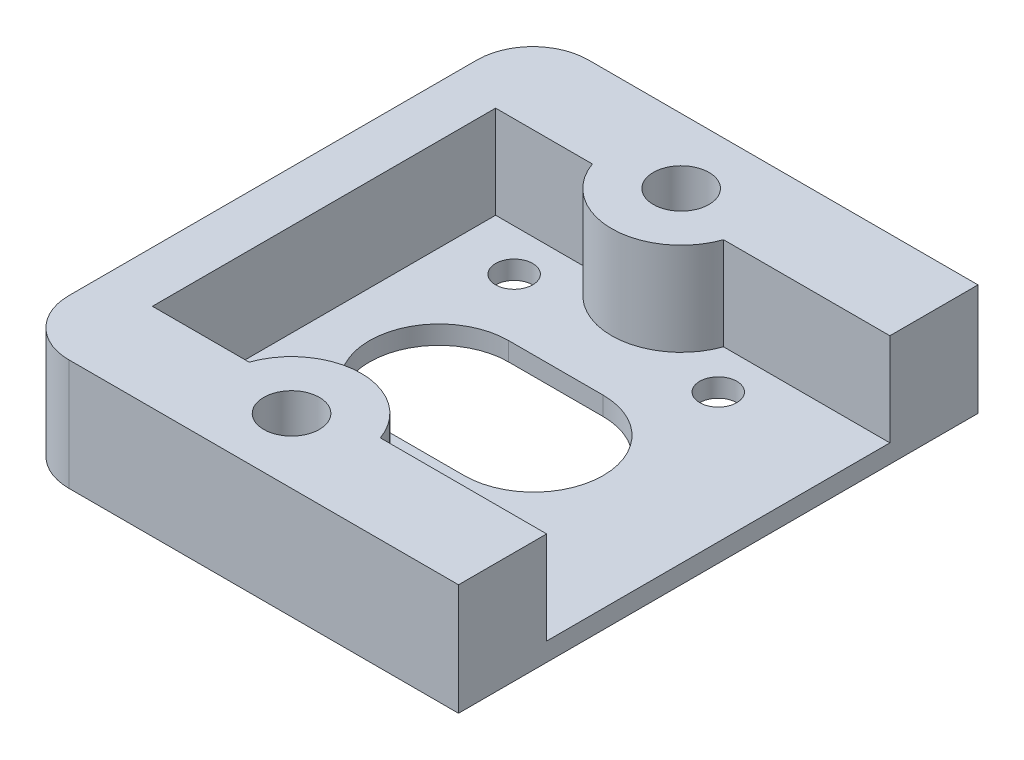
ISO-10303-21;
HEADER;
FILE_DESCRIPTION(('STEP AP214'),'2;1');
FILE_NAME('part.step','',(''),(''),'','','');
FILE_SCHEMA(('AUTOMOTIVE_DESIGN { 1 0 10303 214 1 1 1 1 }'));
ENDSEC;
DATA;
#1=APPLICATION_CONTEXT('core data for automotive mechanical design processes');
#2=APPLICATION_PROTOCOL_DEFINITION('international standard','automotive_design',2000,#1);
#3=PRODUCT_CONTEXT('',#1,'mechanical');
#4=PRODUCT('Part','Part','',(#3));
#5=PRODUCT_RELATED_PRODUCT_CATEGORY('part','',(#4));
#6=PRODUCT_DEFINITION_FORMATION('','',#4);
#7=PRODUCT_DEFINITION_CONTEXT('part definition',#1,'design');
#8=PRODUCT_DEFINITION('design','',#6,#7);
#9=PRODUCT_DEFINITION_SHAPE('','',#8);
#10=(LENGTH_UNIT() NAMED_UNIT(*) SI_UNIT(.MILLI.,.METRE.));
#11=(NAMED_UNIT(*) PLANE_ANGLE_UNIT() SI_UNIT($,.RADIAN.));
#12=(NAMED_UNIT(*) SI_UNIT($,.STERADIAN.) SOLID_ANGLE_UNIT());
#13=UNCERTAINTY_MEASURE_WITH_UNIT(LENGTH_MEASURE(1.E-05),#10,'distance_accuracy_value','');
#14=(GEOMETRIC_REPRESENTATION_CONTEXT(3) GLOBAL_UNCERTAINTY_ASSIGNED_CONTEXT((#13)) GLOBAL_UNIT_ASSIGNED_CONTEXT((#10,
#11,#12)) REPRESENTATION_CONTEXT('',''));
#15=CARTESIAN_POINT('',(0.,0.,0.));
#16=DIRECTION('',(0.,0.,1.));
#17=DIRECTION('',(1.,0.,0.));
#18=AXIS2_PLACEMENT_3D('',#15,#16,#17);
#19=CARTESIAN_POINT('',(2.75,1.,23.25));
#20=DIRECTION('',(0.,0.,1.));
#21=DIRECTION('',(1.,0.,0.));
#22=AXIS2_PLACEMENT_3D('',#19,#20,#21);
#23=PLANE('',#22);
#24=DIRECTION('',(1.,0.,0.));
#25=VECTOR('',#24,1.);
#26=CARTESIAN_POINT('',(2.75,1.,23.25));
#27=LINE('',#26,#25);
#28=CARTESIAN_POINT('',(15.0355339059327,1.,23.25));
#29=VERTEX_POINT('',#28);
#30=CARTESIAN_POINT('',(24.,1.,23.25));
#31=VERTEX_POINT('',#30);
#32=EDGE_CURVE('E189',#29,#31,#27,.T.);
#33=ORIENTED_EDGE('',*,*,#32,.F.);
#34=DIRECTION('',(0.,1.,0.));
#35=VECTOR('',#34,1.);
#36=CARTESIAN_POINT('',(15.0355339059327,0.,23.25));
#37=LINE('',#36,#35);
#38=CARTESIAN_POINT('',(15.0355339059327,6.,23.25));
#39=VERTEX_POINT('',#38);
#40=EDGE_CURVE('E174',#29,#39,#37,.T.);
#41=ORIENTED_EDGE('',*,*,#40,.T.);
#42=DIRECTION('',(1.,0.,0.));
#43=VECTOR('',#42,1.);
#44=CARTESIAN_POINT('',(2.75,6.,23.25));
#45=LINE('',#44,#43);
#46=CARTESIAN_POINT('',(24.,6.,23.25));
#47=VERTEX_POINT('',#46);
#48=EDGE_CURVE('E187',#39,#47,#45,.T.);
#49=ORIENTED_EDGE('',*,*,#48,.T.);
#50=DIRECTION('',(0.,1.,0.));
#51=VECTOR('',#50,1.);
#52=CARTESIAN_POINT('',(24.,1.,23.25));
#53=LINE('',#52,#51);
#54=EDGE_CURVE('E542',#31,#47,#53,.T.);
#55=ORIENTED_EDGE('',*,*,#54,.F.);
#56=EDGE_LOOP('',(#33,#41,#49,#55));
#57=FACE_BOUND('',#56,.T.);
#58=ADVANCED_FACE('F45',(#57),#23,.F.);
#59=CARTESIAN_POINT('',(2.75,1.,4.75));
#60=DIRECTION('',(0.,0.,-1.));
#61=DIRECTION('',(-1.,0.,0.));
#62=AXIS2_PLACEMENT_3D('',#59,#60,#61);
#63=PLANE('',#62);
#64=DIRECTION('',(-1.,0.,0.));
#65=VECTOR('',#64,1.);
#66=CARTESIAN_POINT('',(2.75,1.,4.75));
#67=LINE('',#66,#65);
#68=CARTESIAN_POINT('',(7.96446609406726,1.,4.75));
#69=VERTEX_POINT('',#68);
#70=CARTESIAN_POINT('',(2.75,1.,4.75));
#71=VERTEX_POINT('',#70);
#72=EDGE_CURVE('E361',#69,#71,#67,.T.);
#73=ORIENTED_EDGE('',*,*,#72,.F.);
#74=DIRECTION('',(0.,1.,0.));
#75=VECTOR('',#74,1.);
#76=CARTESIAN_POINT('',(7.96446609406726,0.,4.75));
#77=LINE('',#76,#75);
#78=CARTESIAN_POINT('',(7.96446609406726,6.,4.75));
#79=VERTEX_POINT('',#78);
#80=EDGE_CURVE('E362',#69,#79,#77,.T.);
#81=ORIENTED_EDGE('',*,*,#80,.T.);
#82=DIRECTION('',(-1.,0.,0.));
#83=VECTOR('',#82,1.);
#84=CARTESIAN_POINT('',(2.75,6.,4.75));
#85=LINE('',#84,#83);
#86=CARTESIAN_POINT('',(2.75,6.,4.75));
#87=VERTEX_POINT('',#86);
#88=EDGE_CURVE('E203',#79,#87,#85,.T.);
#89=ORIENTED_EDGE('',*,*,#88,.T.);
#90=DIRECTION('',(0.,1.,0.));
#91=VECTOR('',#90,1.);
#92=CARTESIAN_POINT('',(2.75,1.,4.75));
#93=LINE('',#92,#91);
#94=EDGE_CURVE('E213',#71,#87,#93,.T.);
#95=ORIENTED_EDGE('',*,*,#94,.F.);
#96=EDGE_LOOP('',(#73,#81,#89,#95));
#97=FACE_BOUND('',#96,.T.);
#98=ADVANCED_FACE('F326',(#97),#63,.F.);
#99=CARTESIAN_POINT('',(0.,6.,0.));
#100=DIRECTION('',(1.,0.,0.));
#101=DIRECTION('',(0.,0.,-1.));
#102=AXIS2_PLACEMENT_3D('',#99,#100,#101);
#103=PLANE('',#102);
#104=DIRECTION('',(0.,0.,1.));
#105=VECTOR('',#104,1.);
#106=CARTESIAN_POINT('',(0.,6.,0.));
#107=LINE('',#106,#105);
#108=CARTESIAN_POINT('',(0.,6.,3.));
#109=VERTEX_POINT('',#108);
#110=CARTESIAN_POINT('',(0.,6.,25.));
#111=VERTEX_POINT('',#110);
#112=EDGE_CURVE('E223',#109,#111,#107,.T.);
#113=ORIENTED_EDGE('',*,*,#112,.F.);
#114=DIRECTION('',(0.,-1.,0.));
#115=VECTOR('',#114,1.);
#116=CARTESIAN_POINT('',(0.,6.,3.));
#117=LINE('',#116,#115);
#118=CARTESIAN_POINT('',(0.,0.,3.));
#119=VERTEX_POINT('',#118);
#120=EDGE_CURVE('E273',#109,#119,#117,.T.);
#121=ORIENTED_EDGE('',*,*,#120,.T.);
#122=DIRECTION('',(0.,0.,1.));
#123=VECTOR('',#122,1.);
#124=CARTESIAN_POINT('',(0.,0.,0.));
#125=LINE('',#124,#123);
#126=CARTESIAN_POINT('',(0.,0.,25.));
#127=VERTEX_POINT('',#126);
#128=EDGE_CURVE('E217',#119,#127,#125,.T.);
#129=ORIENTED_EDGE('',*,*,#128,.T.);
#130=DIRECTION('',(0.,-1.,0.));
#131=VECTOR('',#130,1.);
#132=CARTESIAN_POINT('',(0.,6.,25.));
#133=LINE('',#132,#131);
#134=EDGE_CURVE('E270',#127,#111,#133,.F.);
#135=ORIENTED_EDGE('',*,*,#134,.T.);
#136=EDGE_LOOP('',(#113,#121,#129,#135));
#137=FACE_BOUND('',#136,.T.);
#138=ADVANCED_FACE('F333',(#137),#103,.F.);
#139=CARTESIAN_POINT('',(0.,6.,28.));
#140=DIRECTION('',(0.,0.,-1.));
#141=DIRECTION('',(-1.,0.,0.));
#142=AXIS2_PLACEMENT_3D('',#139,#140,#141);
#143=PLANE('',#142);
#144=DIRECTION('',(0.,-1.,0.));
#145=VECTOR('',#144,1.);
#146=CARTESIAN_POINT('',(24.,6.,28.));
#147=LINE('',#146,#145);
#148=CARTESIAN_POINT('',(24.,6.,28.));
#149=VERTEX_POINT('',#148);
#150=CARTESIAN_POINT('',(24.,0.,28.));
#151=VERTEX_POINT('',#150);
#152=EDGE_CURVE('E250',#149,#151,#147,.T.);
#153=ORIENTED_EDGE('',*,*,#152,.F.);
#154=DIRECTION('',(1.,0.,0.));
#155=VECTOR('',#154,1.);
#156=CARTESIAN_POINT('',(0.,6.,28.));
#157=LINE('',#156,#155);
#158=CARTESIAN_POINT('',(3.00000000000001,6.,28.));
#159=VERTEX_POINT('',#158);
#160=EDGE_CURVE('E226',#159,#149,#157,.T.);
#161=ORIENTED_EDGE('',*,*,#160,.F.);
#162=DIRECTION('',(0.,-1.,0.));
#163=VECTOR('',#162,1.);
#164=CARTESIAN_POINT('',(3.00000000000001,6.,28.));
#165=LINE('',#164,#163);
#166=CARTESIAN_POINT('',(3.00000000000001,0.,28.));
#167=VERTEX_POINT('',#166);
#168=EDGE_CURVE('E292',#159,#167,#165,.T.);
#169=ORIENTED_EDGE('',*,*,#168,.T.);
#170=DIRECTION('',(1.,0.,0.));
#171=VECTOR('',#170,1.);
#172=CARTESIAN_POINT('',(0.,0.,28.));
#173=LINE('',#172,#171);
#174=EDGE_CURVE('E239',#167,#151,#173,.T.);
#175=ORIENTED_EDGE('',*,*,#174,.T.);
#176=EDGE_LOOP('',(#153,#161,#169,#175));
#177=FACE_BOUND('',#176,.T.);
#178=ADVANCED_FACE('F398',(#177),#143,.F.);
#179=CARTESIAN_POINT('',(24.,6.,0.));
#180=DIRECTION('',(-1.,0.,0.));
#181=DIRECTION('',(0.,0.,1.));
#182=AXIS2_PLACEMENT_3D('',#179,#180,#181);
#183=PLANE('',#182);
#184=DIRECTION('',(0.,0.,-1.));
#185=VECTOR('',#184,1.);
#186=CARTESIAN_POINT('',(24.,6.,0.));
#187=LINE('',#186,#185);
#188=CARTESIAN_POINT('',(24.,6.,4.75));
#189=VERTEX_POINT('',#188);
#190=CARTESIAN_POINT('',(24.,6.,0.));
#191=VERTEX_POINT('',#190);
#192=EDGE_CURVE('E230',#189,#191,#187,.T.);
#193=ORIENTED_EDGE('',*,*,#192,.F.);
#194=DIRECTION('',(0.,1.,0.));
#195=VECTOR('',#194,1.);
#196=CARTESIAN_POINT('',(24.,1.,4.75));
#197=LINE('',#196,#195);
#198=CARTESIAN_POINT('',(24.,1.,4.75));
#199=VERTEX_POINT('',#198);
#200=EDGE_CURVE('E540',#199,#189,#197,.T.);
#201=ORIENTED_EDGE('',*,*,#200,.F.);
#202=DIRECTION('',(0.,0.,-1.));
#203=VECTOR('',#202,1.);
#204=CARTESIAN_POINT('',(24.,1.,4.75));
#205=LINE('',#204,#203);
#206=EDGE_CURVE('E545',#31,#199,#205,.T.);
#207=ORIENTED_EDGE('',*,*,#206,.F.);
#208=ORIENTED_EDGE('',*,*,#54,.T.);
#209=EDGE_CURVE('E196',#149,#47,#187,.T.);
#210=ORIENTED_EDGE('',*,*,#209,.F.);
#211=ORIENTED_EDGE('',*,*,#152,.T.);
#212=DIRECTION('',(0.,0.,-1.));
#213=VECTOR('',#212,1.);
#214=CARTESIAN_POINT('',(24.,0.,0.));
#215=LINE('',#214,#213);
#216=CARTESIAN_POINT('',(24.,0.,0.));
#217=VERTEX_POINT('',#216);
#218=EDGE_CURVE('E242',#151,#217,#215,.T.);
#219=ORIENTED_EDGE('',*,*,#218,.T.);
#220=DIRECTION('',(0.,-1.,0.));
#221=VECTOR('',#220,1.);
#222=CARTESIAN_POINT('',(24.,6.,0.));
#223=LINE('',#222,#221);
#224=EDGE_CURVE('E235',#191,#217,#223,.T.);
#225=ORIENTED_EDGE('',*,*,#224,.F.);
#226=EDGE_LOOP('',(#193,#201,#207,#208,#210,#211,#219,#225));
#227=FACE_BOUND('',#226,.T.);
#228=ADVANCED_FACE('F379',(#227),#183,.F.);
#229=CARTESIAN_POINT('',(0.,6.,0.));
#230=DIRECTION('',(0.,0.,1.));
#231=DIRECTION('',(1.,0.,0.));
#232=AXIS2_PLACEMENT_3D('',#229,#230,#231);
#233=PLANE('',#232);
#234=DIRECTION('',(0.,-1.,0.));
#235=VECTOR('',#234,1.);
#236=CARTESIAN_POINT('',(3.,6.,0.));
#237=LINE('',#236,#235);
#238=CARTESIAN_POINT('',(3.,0.,0.));
#239=VERTEX_POINT('',#238);
#240=CARTESIAN_POINT('',(3.,6.,0.));
#241=VERTEX_POINT('',#240);
#242=EDGE_CURVE('E284',#239,#241,#237,.F.);
#243=ORIENTED_EDGE('',*,*,#242,.T.);
#244=DIRECTION('',(-1.,0.,0.));
#245=VECTOR('',#244,1.);
#246=CARTESIAN_POINT('',(0.,6.,0.));
#247=LINE('',#246,#245);
#248=EDGE_CURVE('E70',#191,#241,#247,.T.);
#249=ORIENTED_EDGE('',*,*,#248,.F.);
#250=ORIENTED_EDGE('',*,*,#224,.T.);
#251=DIRECTION('',(-1.,0.,0.));
#252=VECTOR('',#251,1.);
#253=CARTESIAN_POINT('',(0.,0.,0.));
#254=LINE('',#253,#252);
#255=EDGE_CURVE('E227',#217,#239,#254,.T.);
#256=ORIENTED_EDGE('',*,*,#255,.T.);
#257=EDGE_LOOP('',(#243,#249,#250,#256));
#258=FACE_BOUND('',#257,.T.);
#259=ADVANCED_FACE('F383',(#258),#233,.F.);
#260=CARTESIAN_POINT('',(0.,6.,0.));
#261=DIRECTION('',(0.,1.,0.));
#262=DIRECTION('',(0.,0.,1.));
#263=AXIS2_PLACEMENT_3D('',#260,#261,#262);
#264=PLANE('',#263);
#265=CARTESIAN_POINT('',(11.5,6.,3.5));
#266=DIRECTION('',(0.,1.,0.));
#267=DIRECTION('',(0.,0.,1.));
#268=AXIS2_PLACEMENT_3D('',#265,#266,#267);
#269=CIRCLE('',#268,1.5);
#270=CARTESIAN_POINT('',(11.5,6.,5.));
#271=VERTEX_POINT('',#270);
#272=EDGE_CURVE('E191',#271,#271,#269,.T.);
#273=ORIENTED_EDGE('',*,*,#272,.F.);
#274=EDGE_LOOP('',(#273));
#275=FACE_BOUND('',#274,.T.);
#276=CARTESIAN_POINT('',(11.5,6.,24.5));
#277=DIRECTION('',(0.,1.,0.));
#278=DIRECTION('',(0.,0.,1.));
#279=AXIS2_PLACEMENT_3D('',#276,#277,#278);
#280=CIRCLE('',#279,1.5);
#281=CARTESIAN_POINT('',(11.5,6.,26.));
#282=VERTEX_POINT('',#281);
#283=EDGE_CURVE('E182',#282,#282,#280,.T.);
#284=ORIENTED_EDGE('',*,*,#283,.F.);
#285=EDGE_LOOP('',(#284));
#286=FACE_BOUND('',#285,.T.);
#287=ORIENTED_EDGE('',*,*,#160,.T.);
#288=ORIENTED_EDGE('',*,*,#209,.T.);
#289=ORIENTED_EDGE('',*,*,#48,.F.);
#290=CARTESIAN_POINT('',(11.5,6.,24.5));
#291=DIRECTION('',(0.,1.,0.));
#292=DIRECTION('',(0.,0.,-1.));
#293=AXIS2_PLACEMENT_3D('',#290,#291,#292);
#294=CIRCLE('',#293,3.75);
#295=CARTESIAN_POINT('',(7.96446609406726,6.,23.25));
#296=VERTEX_POINT('',#295);
#297=EDGE_CURVE('E171',#39,#296,#294,.T.);
#298=ORIENTED_EDGE('',*,*,#297,.T.);
#299=CARTESIAN_POINT('',(2.75,6.,23.25));
#300=VERTEX_POINT('',#299);
#301=EDGE_CURVE('E198',#300,#296,#45,.T.);
#302=ORIENTED_EDGE('',*,*,#301,.F.);
#303=DIRECTION('',(0.,0.,1.));
#304=VECTOR('',#303,1.);
#305=CARTESIAN_POINT('',(2.75,6.,4.75));
#306=LINE('',#305,#304);
#307=EDGE_CURVE('E199',#87,#300,#306,.T.);
#308=ORIENTED_EDGE('',*,*,#307,.F.);
#309=ORIENTED_EDGE('',*,*,#88,.F.);
#310=CARTESIAN_POINT('',(11.5,6.,3.5));
#311=DIRECTION('',(0.,1.,0.));
#312=DIRECTION('',(0.,0.,1.));
#313=AXIS2_PLACEMENT_3D('',#310,#311,#312);
#314=CIRCLE('',#313,3.75);
#315=CARTESIAN_POINT('',(15.0355339059327,6.,4.75));
#316=VERTEX_POINT('',#315);
#317=EDGE_CURVE('E557',#79,#316,#314,.T.);
#318=ORIENTED_EDGE('',*,*,#317,.T.);
#319=EDGE_CURVE('E208',#189,#316,#85,.T.);
#320=ORIENTED_EDGE('',*,*,#319,.F.);
#321=ORIENTED_EDGE('',*,*,#192,.T.);
#322=ORIENTED_EDGE('',*,*,#248,.T.);
#323=CARTESIAN_POINT('',(3.,6.,3.));
#324=DIRECTION('',(0.,1.,0.));
#325=DIRECTION('',(0.,0.,1.));
#326=AXIS2_PLACEMENT_3D('',#323,#324,#325);
#327=CIRCLE('',#326,3.);
#328=EDGE_CURVE('E289',#241,#109,#327,.T.);
#329=ORIENTED_EDGE('',*,*,#328,.T.);
#330=ORIENTED_EDGE('',*,*,#112,.T.);
#331=CARTESIAN_POINT('',(3.00000000000001,6.,25.));
#332=DIRECTION('',(0.,1.,0.));
#333=DIRECTION('',(0.,0.,1.));
#334=AXIS2_PLACEMENT_3D('',#331,#332,#333);
#335=CIRCLE('',#334,3.);
#336=EDGE_CURVE('E63',#111,#159,#335,.T.);
#337=ORIENTED_EDGE('',*,*,#336,.T.);
#338=EDGE_LOOP('',(#287,#288,#289,#298,#302,#308,#309,#318,#320,#321,#322,#329,#330,#337));
#339=FACE_BOUND('',#338,.T.);
#340=ADVANCED_FACE('F194',(#275,#286,#339),#264,.T.);
#341=CARTESIAN_POINT('',(0.,0.,0.));
#342=DIRECTION('',(0.,1.,0.));
#343=DIRECTION('',(0.,0.,1.));
#344=AXIS2_PLACEMENT_3D('',#341,#342,#343);
#345=PLANE('',#344);
#346=CARTESIAN_POINT('',(11.5,0.,3.5));
#347=DIRECTION('',(0.,1.,0.));
#348=DIRECTION('',(0.,0.,1.));
#349=AXIS2_PLACEMENT_3D('',#346,#347,#348);
#350=CIRCLE('',#349,1.5);
#351=CARTESIAN_POINT('',(11.5,0.,5.));
#352=VERTEX_POINT('',#351);
#353=EDGE_CURVE('E49',#352,#352,#350,.T.);
#354=ORIENTED_EDGE('',*,*,#353,.T.);
#355=EDGE_LOOP('',(#354));
#356=FACE_BOUND('',#355,.T.);
#357=CARTESIAN_POINT('',(11.5,0.,24.5));
#358=DIRECTION('',(0.,1.,0.));
#359=DIRECTION('',(0.,0.,1.));
#360=AXIS2_PLACEMENT_3D('',#357,#358,#359);
#361=CIRCLE('',#360,1.5);
#362=CARTESIAN_POINT('',(11.5,0.,26.));
#363=VERTEX_POINT('',#362);
#364=EDGE_CURVE('E297',#363,#363,#361,.T.);
#365=ORIENTED_EDGE('',*,*,#364,.T.);
#366=EDGE_LOOP('',(#365));
#367=FACE_BOUND('',#366,.T.);
#368=CARTESIAN_POINT('',(17.,0.,7.));
#369=DIRECTION('',(0.,1.,0.));
#370=DIRECTION('',(0.,0.,1.));
#371=AXIS2_PLACEMENT_3D('',#368,#369,#370);
#372=CIRCLE('',#371,0.999999999999998);
#373=CARTESIAN_POINT('',(17.,0.,8.));
#374=VERTEX_POINT('',#373);
#375=EDGE_CURVE('E204',#374,#374,#372,.T.);
#376=ORIENTED_EDGE('',*,*,#375,.T.);
#377=EDGE_LOOP('',(#376));
#378=FACE_BOUND('',#377,.T.);
#379=CARTESIAN_POINT('',(17.,0.,21.));
#380=DIRECTION('',(0.,1.,0.));
#381=DIRECTION('',(0.,0.,1.));
#382=AXIS2_PLACEMENT_3D('',#379,#380,#381);
#383=CIRCLE('',#382,0.999999999999998);
#384=CARTESIAN_POINT('',(17.,0.,22.));
#385=VERTEX_POINT('',#384);
#386=EDGE_CURVE('E497',#385,#385,#383,.T.);
#387=ORIENTED_EDGE('',*,*,#386,.T.);
#388=EDGE_LOOP('',(#387));
#389=FACE_BOUND('',#388,.T.);
#390=CARTESIAN_POINT('',(6.,0.,21.));
#391=DIRECTION('',(0.,1.,0.));
#392=DIRECTION('',(0.,0.,1.));
#393=AXIS2_PLACEMENT_3D('',#390,#391,#392);
#394=CIRCLE('',#393,1.);
#395=CARTESIAN_POINT('',(6.,0.,22.));
#396=VERTEX_POINT('',#395);
#397=EDGE_CURVE('E493',#396,#396,#394,.T.);
#398=ORIENTED_EDGE('',*,*,#397,.T.);
#399=EDGE_LOOP('',(#398));
#400=FACE_BOUND('',#399,.T.);
#401=CARTESIAN_POINT('',(6.,0.,7.));
#402=DIRECTION('',(0.,1.,0.));
#403=DIRECTION('',(0.,0.,1.));
#404=AXIS2_PLACEMENT_3D('',#401,#402,#403);
#405=CIRCLE('',#404,1.);
#406=CARTESIAN_POINT('',(6.,0.,8.));
#407=VERTEX_POINT('',#406);
#408=EDGE_CURVE('E452',#407,#407,#405,.T.);
#409=ORIENTED_EDGE('',*,*,#408,.T.);
#410=EDGE_LOOP('',(#409));
#411=FACE_BOUND('',#410,.T.);
#412=DIRECTION('',(-1.,0.,0.));
#413=VECTOR('',#412,1.);
#414=CARTESIAN_POINT('',(0.,0.,10.25));
#415=LINE('',#414,#413);
#416=CARTESIAN_POINT('',(14.05,0.,10.25));
#417=VERTEX_POINT('',#416);
#418=CARTESIAN_POINT('',(8.95,0.,10.25));
#419=VERTEX_POINT('',#418);
#420=EDGE_CURVE('E262',#417,#419,#415,.T.);
#421=ORIENTED_EDGE('',*,*,#420,.T.);
#422=CARTESIAN_POINT('',(8.95,0.,14.));
#423=DIRECTION('',(0.,1.,0.));
#424=DIRECTION('',(0.,0.,1.));
#425=AXIS2_PLACEMENT_3D('',#422,#423,#424);
#426=CIRCLE('',#425,3.75);
#427=CARTESIAN_POINT('',(8.95,0.,17.75));
#428=VERTEX_POINT('',#427);
#429=EDGE_CURVE('E266',#419,#428,#426,.T.);
#430=ORIENTED_EDGE('',*,*,#429,.T.);
#431=DIRECTION('',(1.,0.,0.));
#432=VECTOR('',#431,1.);
#433=CARTESIAN_POINT('',(0.,0.,17.75));
#434=LINE('',#433,#432);
#435=CARTESIAN_POINT('',(14.05,0.,17.75));
#436=VERTEX_POINT('',#435);
#437=EDGE_CURVE('E254',#428,#436,#434,.T.);
#438=ORIENTED_EDGE('',*,*,#437,.T.);
#439=CARTESIAN_POINT('',(14.05,0.,14.));
#440=DIRECTION('',(0.,1.,0.));
#441=DIRECTION('',(0.,0.,1.));
#442=AXIS2_PLACEMENT_3D('',#439,#440,#441);
#443=CIRCLE('',#442,3.75);
#444=EDGE_CURVE('E258',#436,#417,#443,.T.);
#445=ORIENTED_EDGE('',*,*,#444,.T.);
#446=EDGE_LOOP('',(#421,#430,#438,#445));
#447=FACE_BOUND('',#446,.T.);
#448=ORIENTED_EDGE('',*,*,#218,.F.);
#449=ORIENTED_EDGE('',*,*,#174,.F.);
#450=CARTESIAN_POINT('',(3.00000000000001,0.,25.));
#451=DIRECTION('',(0.,1.,0.));
#452=DIRECTION('',(0.,0.,1.));
#453=AXIS2_PLACEMENT_3D('',#450,#451,#452);
#454=CIRCLE('',#453,3.);
#455=EDGE_CURVE('E277',#167,#127,#454,.F.);
#456=ORIENTED_EDGE('',*,*,#455,.T.);
#457=ORIENTED_EDGE('',*,*,#128,.F.);
#458=CARTESIAN_POINT('',(3.,0.,3.));
#459=DIRECTION('',(0.,1.,0.));
#460=DIRECTION('',(0.,0.,1.));
#461=AXIS2_PLACEMENT_3D('',#458,#459,#460);
#462=CIRCLE('',#461,3.);
#463=EDGE_CURVE('E280',#119,#239,#462,.F.);
#464=ORIENTED_EDGE('',*,*,#463,.T.);
#465=ORIENTED_EDGE('',*,*,#255,.F.);
#466=EDGE_LOOP('',(#448,#449,#456,#457,#464,#465));
#467=FACE_BOUND('',#466,.T.);
#468=ADVANCED_FACE('F306',(#356,#367,#378,#389,#400,#411,#447,#467),#345,.F.);
#469=CARTESIAN_POINT('',(2.75,1.,4.75));
#470=DIRECTION('',(-1.,0.,0.));
#471=DIRECTION('',(0.,0.,1.));
#472=AXIS2_PLACEMENT_3D('',#469,#470,#471);
#473=PLANE('',#472);
#474=ORIENTED_EDGE('',*,*,#307,.T.);
#475=DIRECTION('',(0.,1.,0.));
#476=VECTOR('',#475,1.);
#477=CARTESIAN_POINT('',(2.75,1.,23.25));
#478=LINE('',#477,#476);
#479=CARTESIAN_POINT('',(2.75,1.,23.25));
#480=VERTEX_POINT('',#479);
#481=EDGE_CURVE('E218',#480,#300,#478,.T.);
#482=ORIENTED_EDGE('',*,*,#481,.F.);
#483=DIRECTION('',(0.,0.,1.));
#484=VECTOR('',#483,1.);
#485=CARTESIAN_POINT('',(2.75,1.,4.75));
#486=LINE('',#485,#484);
#487=EDGE_CURVE('E212',#71,#480,#486,.T.);
#488=ORIENTED_EDGE('',*,*,#487,.F.);
#489=ORIENTED_EDGE('',*,*,#94,.T.);
#490=EDGE_LOOP('',(#474,#482,#488,#489));
#491=FACE_BOUND('',#490,.T.);
#492=ADVANCED_FACE('F348',(#491),#473,.F.);
#493=ORIENTED_EDGE('',*,*,#319,.T.);
#494=DIRECTION('',(0.,1.,0.));
#495=VECTOR('',#494,1.);
#496=CARTESIAN_POINT('',(15.0355339059327,0.,4.75));
#497=LINE('',#496,#495);
#498=CARTESIAN_POINT('',(15.0355339059327,1.,4.75));
#499=VERTEX_POINT('',#498);
#500=EDGE_CURVE('E553',#316,#499,#497,.F.);
#501=ORIENTED_EDGE('',*,*,#500,.T.);
#502=EDGE_CURVE('E222',#199,#499,#67,.T.);
#503=ORIENTED_EDGE('',*,*,#502,.F.);
#504=ORIENTED_EDGE('',*,*,#200,.T.);
#505=EDGE_LOOP('',(#493,#501,#503,#504));
#506=FACE_BOUND('',#505,.T.);
#507=ADVANCED_FACE('F336',(#506),#63,.F.);
#508=ORIENTED_EDGE('',*,*,#301,.T.);
#509=DIRECTION('',(0.,1.,0.));
#510=VECTOR('',#509,1.);
#511=CARTESIAN_POINT('',(7.96446609406726,0.,23.25));
#512=LINE('',#511,#510);
#513=CARTESIAN_POINT('',(7.96446609406726,1.,23.25));
#514=VERTEX_POINT('',#513);
#515=EDGE_CURVE('E177',#296,#514,#512,.F.);
#516=ORIENTED_EDGE('',*,*,#515,.T.);
#517=EDGE_CURVE('E368',#480,#514,#27,.T.);
#518=ORIENTED_EDGE('',*,*,#517,.F.);
#519=ORIENTED_EDGE('',*,*,#481,.T.);
#520=EDGE_LOOP('',(#508,#516,#518,#519));
#521=FACE_BOUND('',#520,.T.);
#522=ADVANCED_FACE('F328',(#521),#23,.F.);
#523=CARTESIAN_POINT('',(0.,1.,0.));
#524=DIRECTION('',(0.,1.,0.));
#525=DIRECTION('',(0.,0.,1.));
#526=AXIS2_PLACEMENT_3D('',#523,#524,#525);
#527=PLANE('',#526);
#528=CARTESIAN_POINT('',(11.5,1.,24.5));
#529=DIRECTION('',(0.,1.,0.));
#530=DIRECTION('',(0.,0.,1.));
#531=AXIS2_PLACEMENT_3D('',#528,#529,#530);
#532=CIRCLE('',#531,3.75);
#533=EDGE_CURVE('E11',#29,#514,#532,.T.);
#534=ORIENTED_EDGE('',*,*,#533,.F.);
#535=ORIENTED_EDGE('',*,*,#32,.T.);
#536=ORIENTED_EDGE('',*,*,#206,.T.);
#537=ORIENTED_EDGE('',*,*,#502,.T.);
#538=CARTESIAN_POINT('',(11.5,1.,3.5));
#539=DIRECTION('',(0.,1.,0.));
#540=DIRECTION('',(0.,0.,1.));
#541=AXIS2_PLACEMENT_3D('',#538,#539,#540);
#542=CIRCLE('',#541,3.75);
#543=EDGE_CURVE('E55',#69,#499,#542,.T.);
#544=ORIENTED_EDGE('',*,*,#543,.F.);
#545=ORIENTED_EDGE('',*,*,#72,.T.);
#546=ORIENTED_EDGE('',*,*,#487,.T.);
#547=ORIENTED_EDGE('',*,*,#517,.T.);
#548=EDGE_LOOP('',(#534,#535,#536,#537,#544,#545,#546,#547));
#549=FACE_BOUND('',#548,.T.);
#550=CARTESIAN_POINT('',(8.95,1.,14.));
#551=DIRECTION('',(0.,1.,0.));
#552=DIRECTION('',(0.,0.,1.));
#553=AXIS2_PLACEMENT_3D('',#550,#551,#552);
#554=CIRCLE('',#553,3.75);
#555=CARTESIAN_POINT('',(8.95,1.,10.25));
#556=VERTEX_POINT('',#555);
#557=CARTESIAN_POINT('',(8.95,1.,17.75));
#558=VERTEX_POINT('',#557);
#559=EDGE_CURVE('E449',#556,#558,#554,.T.);
#560=ORIENTED_EDGE('',*,*,#559,.F.);
#561=DIRECTION('',(-1.,0.,0.));
#562=VECTOR('',#561,1.);
#563=CARTESIAN_POINT('',(8.95,1.,10.25));
#564=LINE('',#563,#562);
#565=CARTESIAN_POINT('',(14.05,1.,10.25));
#566=VERTEX_POINT('',#565);
#567=EDGE_CURVE('E457',#566,#556,#564,.T.);
#568=ORIENTED_EDGE('',*,*,#567,.F.);
#569=CARTESIAN_POINT('',(14.05,1.,14.));
#570=DIRECTION('',(0.,1.,0.));
#571=DIRECTION('',(0.,0.,1.));
#572=AXIS2_PLACEMENT_3D('',#569,#570,#571);
#573=CIRCLE('',#572,3.75);
#574=CARTESIAN_POINT('',(14.05,1.,17.75));
#575=VERTEX_POINT('',#574);
#576=EDGE_CURVE('E463',#575,#566,#573,.T.);
#577=ORIENTED_EDGE('',*,*,#576,.F.);
#578=DIRECTION('',(1.,0.,0.));
#579=VECTOR('',#578,1.);
#580=CARTESIAN_POINT('',(8.95,1.,17.75));
#581=LINE('',#580,#579);
#582=EDGE_CURVE('E467',#558,#575,#581,.T.);
#583=ORIENTED_EDGE('',*,*,#582,.F.);
#584=EDGE_LOOP('',(#560,#568,#577,#583));
#585=FACE_BOUND('',#584,.T.);
#586=CARTESIAN_POINT('',(17.,1.,7.));
#587=DIRECTION('',(0.,1.,0.));
#588=DIRECTION('',(0.,0.,-1.));
#589=AXIS2_PLACEMENT_3D('',#586,#587,#588);
#590=CIRCLE('',#589,0.999999999999998);
#591=CARTESIAN_POINT('',(17.,1.,6.));
#592=VERTEX_POINT('',#591);
#593=EDGE_CURVE('E478',#592,#592,#590,.T.);
#594=ORIENTED_EDGE('',*,*,#593,.F.);
#595=EDGE_LOOP('',(#594));
#596=FACE_BOUND('',#595,.T.);
#597=CARTESIAN_POINT('',(17.,1.,21.));
#598=DIRECTION('',(0.,1.,0.));
#599=DIRECTION('',(0.,0.,1.));
#600=AXIS2_PLACEMENT_3D('',#597,#598,#599);
#601=CIRCLE('',#600,0.999999999999998);
#602=CARTESIAN_POINT('',(17.,1.,22.));
#603=VERTEX_POINT('',#602);
#604=EDGE_CURVE('E532',#603,#603,#601,.T.);
#605=ORIENTED_EDGE('',*,*,#604,.F.);
#606=EDGE_LOOP('',(#605));
#607=FACE_BOUND('',#606,.T.);
#608=CARTESIAN_POINT('',(6.,1.,21.));
#609=DIRECTION('',(0.,1.,0.));
#610=DIRECTION('',(0.,0.,-1.));
#611=AXIS2_PLACEMENT_3D('',#608,#609,#610);
#612=CIRCLE('',#611,1.);
#613=CARTESIAN_POINT('',(6.,1.,20.));
#614=VERTEX_POINT('',#613);
#615=EDGE_CURVE('E475',#614,#614,#612,.T.);
#616=ORIENTED_EDGE('',*,*,#615,.F.);
#617=EDGE_LOOP('',(#616));
#618=FACE_BOUND('',#617,.T.);
#619=CARTESIAN_POINT('',(6.,1.,7.));
#620=DIRECTION('',(0.,1.,0.));
#621=DIRECTION('',(0.,0.,1.));
#622=AXIS2_PLACEMENT_3D('',#619,#620,#621);
#623=CIRCLE('',#622,1.);
#624=CARTESIAN_POINT('',(6.,1.,8.));
#625=VERTEX_POINT('',#624);
#626=EDGE_CURVE('E469',#625,#625,#623,.T.);
#627=ORIENTED_EDGE('',*,*,#626,.F.);
#628=EDGE_LOOP('',(#627));
#629=FACE_BOUND('',#628,.T.);
#630=ADVANCED_FACE('F339',(#549,#585,#596,#607,#618,#629),#527,.T.);
#631=CARTESIAN_POINT('',(6.,-4.,7.));
#632=DIRECTION('',(0.,1.,0.));
#633=DIRECTION('',(0.,0.,1.));
#634=AXIS2_PLACEMENT_3D('',#631,#632,#633);
#635=CYLINDRICAL_SURFACE('',#634,1.);
#636=ORIENTED_EDGE('',*,*,#626,.T.);
#637=EDGE_LOOP('',(#636));
#638=FACE_BOUND('',#637,.T.);
#639=ORIENTED_EDGE('',*,*,#408,.F.);
#640=EDGE_LOOP('',(#639));
#641=FACE_BOUND('',#640,.T.);
#642=ADVANCED_FACE('F345',(#638,#641),#635,.F.);
#643=CARTESIAN_POINT('',(6.,-4.,21.));
#644=DIRECTION('',(0.,1.,0.));
#645=DIRECTION('',(0.,0.,1.));
#646=AXIS2_PLACEMENT_3D('',#643,#644,#645);
#647=CYLINDRICAL_SURFACE('',#646,1.);
#648=ORIENTED_EDGE('',*,*,#615,.T.);
#649=EDGE_LOOP('',(#648));
#650=FACE_BOUND('',#649,.T.);
#651=ORIENTED_EDGE('',*,*,#397,.F.);
#652=EDGE_LOOP('',(#651));
#653=FACE_BOUND('',#652,.T.);
#654=ADVANCED_FACE('F516',(#650,#653),#647,.F.);
#655=CARTESIAN_POINT('',(17.,-4.,21.));
#656=DIRECTION('',(0.,1.,0.));
#657=DIRECTION('',(0.,0.,1.));
#658=AXIS2_PLACEMENT_3D('',#655,#656,#657);
#659=CYLINDRICAL_SURFACE('',#658,0.999999999999998);
#660=ORIENTED_EDGE('',*,*,#604,.T.);
#661=EDGE_LOOP('',(#660));
#662=FACE_BOUND('',#661,.T.);
#663=ORIENTED_EDGE('',*,*,#386,.F.);
#664=EDGE_LOOP('',(#663));
#665=FACE_BOUND('',#664,.T.);
#666=ADVANCED_FACE('F440',(#662,#665),#659,.F.);
#667=CARTESIAN_POINT('',(17.,-4.,7.));
#668=DIRECTION('',(0.,1.,0.));
#669=DIRECTION('',(0.,0.,1.));
#670=AXIS2_PLACEMENT_3D('',#667,#668,#669);
#671=CYLINDRICAL_SURFACE('',#670,0.999999999999998);
#672=ORIENTED_EDGE('',*,*,#593,.T.);
#673=EDGE_LOOP('',(#672));
#674=FACE_BOUND('',#673,.T.);
#675=ORIENTED_EDGE('',*,*,#375,.F.);
#676=EDGE_LOOP('',(#675));
#677=FACE_BOUND('',#676,.T.);
#678=ADVANCED_FACE('F433',(#674,#677),#671,.F.);
#679=CARTESIAN_POINT('',(8.95,-4.,14.));
#680=DIRECTION('',(0.,1.,0.));
#681=DIRECTION('',(0.,0.,1.));
#682=AXIS2_PLACEMENT_3D('',#679,#680,#681);
#683=CYLINDRICAL_SURFACE('',#682,3.75);
#684=DIRECTION('',(0.,1.,0.));
#685=VECTOR('',#684,1.);
#686=CARTESIAN_POINT('',(8.95,-4.,10.25));
#687=LINE('',#686,#685);
#688=EDGE_CURVE('E445',#419,#556,#687,.T.);
#689=ORIENTED_EDGE('',*,*,#688,.T.);
#690=ORIENTED_EDGE('',*,*,#559,.T.);
#691=DIRECTION('',(0.,1.,0.));
#692=VECTOR('',#691,1.);
#693=CARTESIAN_POINT('',(8.95,-4.,17.75));
#694=LINE('',#693,#692);
#695=EDGE_CURVE('E462',#428,#558,#694,.T.);
#696=ORIENTED_EDGE('',*,*,#695,.F.);
#697=ORIENTED_EDGE('',*,*,#429,.F.);
#698=EDGE_LOOP('',(#689,#690,#696,#697));
#699=FACE_BOUND('',#698,.T.);
#700=ADVANCED_FACE('F431',(#699),#683,.F.);
#701=CARTESIAN_POINT('',(8.95,-4.,10.25));
#702=DIRECTION('',(0.,0.,-1.));
#703=DIRECTION('',(-1.,0.,0.));
#704=AXIS2_PLACEMENT_3D('',#701,#702,#703);
#705=PLANE('',#704);
#706=DIRECTION('',(0.,1.,0.));
#707=VECTOR('',#706,1.);
#708=CARTESIAN_POINT('',(14.05,-4.,10.25));
#709=LINE('',#708,#707);
#710=EDGE_CURVE('E453',#417,#566,#709,.T.);
#711=ORIENTED_EDGE('',*,*,#710,.T.);
#712=ORIENTED_EDGE('',*,*,#567,.T.);
#713=ORIENTED_EDGE('',*,*,#688,.F.);
#714=ORIENTED_EDGE('',*,*,#420,.F.);
#715=EDGE_LOOP('',(#711,#712,#713,#714));
#716=FACE_BOUND('',#715,.T.);
#717=ADVANCED_FACE('F426',(#716),#705,.F.);
#718=CARTESIAN_POINT('',(14.05,-4.,14.));
#719=DIRECTION('',(0.,1.,0.));
#720=DIRECTION('',(0.,0.,1.));
#721=AXIS2_PLACEMENT_3D('',#718,#719,#720);
#722=CYLINDRICAL_SURFACE('',#721,3.75);
#723=DIRECTION('',(0.,1.,0.));
#724=VECTOR('',#723,1.);
#725=CARTESIAN_POINT('',(14.05,-4.,17.75));
#726=LINE('',#725,#724);
#727=EDGE_CURVE('E485',#436,#575,#726,.T.);
#728=ORIENTED_EDGE('',*,*,#727,.T.);
#729=ORIENTED_EDGE('',*,*,#576,.T.);
#730=ORIENTED_EDGE('',*,*,#710,.F.);
#731=ORIENTED_EDGE('',*,*,#444,.F.);
#732=EDGE_LOOP('',(#728,#729,#730,#731));
#733=FACE_BOUND('',#732,.T.);
#734=ADVANCED_FACE('F420',(#733),#722,.F.);
#735=CARTESIAN_POINT('',(8.95,-4.,17.75));
#736=DIRECTION('',(0.,0.,1.));
#737=DIRECTION('',(1.,0.,0.));
#738=AXIS2_PLACEMENT_3D('',#735,#736,#737);
#739=PLANE('',#738);
#740=ORIENTED_EDGE('',*,*,#695,.T.);
#741=ORIENTED_EDGE('',*,*,#582,.T.);
#742=ORIENTED_EDGE('',*,*,#727,.F.);
#743=ORIENTED_EDGE('',*,*,#437,.F.);
#744=EDGE_LOOP('',(#740,#741,#742,#743));
#745=FACE_BOUND('',#744,.T.);
#746=ADVANCED_FACE('F416',(#745),#739,.F.);
#747=CARTESIAN_POINT('',(3.,6.,3.));
#748=DIRECTION('',(0.,-1.,0.));
#749=DIRECTION('',(0.,0.,-1.));
#750=AXIS2_PLACEMENT_3D('',#747,#748,#749);
#751=CYLINDRICAL_SURFACE('',#750,3.);
#752=ORIENTED_EDGE('',*,*,#328,.F.);
#753=ORIENTED_EDGE('',*,*,#242,.F.);
#754=ORIENTED_EDGE('',*,*,#463,.F.);
#755=ORIENTED_EDGE('',*,*,#120,.F.);
#756=EDGE_LOOP('',(#752,#753,#754,#755));
#757=FACE_BOUND('',#756,.T.);
#758=ADVANCED_FACE('F388',(#757),#751,.T.);
#759=CARTESIAN_POINT('',(3.00000000000001,6.,25.));
#760=DIRECTION('',(0.,-1.,0.));
#761=DIRECTION('',(0.,0.,-1.));
#762=AXIS2_PLACEMENT_3D('',#759,#760,#761);
#763=CYLINDRICAL_SURFACE('',#762,3.);
#764=ORIENTED_EDGE('',*,*,#336,.F.);
#765=ORIENTED_EDGE('',*,*,#134,.F.);
#766=ORIENTED_EDGE('',*,*,#455,.F.);
#767=ORIENTED_EDGE('',*,*,#168,.F.);
#768=EDGE_LOOP('',(#764,#765,#766,#767));
#769=FACE_BOUND('',#768,.T.);
#770=ADVANCED_FACE('F47',(#769),#763,.T.);
#771=CARTESIAN_POINT('',(11.5,0.,3.5));
#772=DIRECTION('',(0.,1.,0.));
#773=DIRECTION('',(0.,0.,1.));
#774=AXIS2_PLACEMENT_3D('',#771,#772,#773);
#775=CYLINDRICAL_SURFACE('',#774,3.75);
#776=ORIENTED_EDGE('',*,*,#80,.F.);
#777=ORIENTED_EDGE('',*,*,#543,.T.);
#778=ORIENTED_EDGE('',*,*,#500,.F.);
#779=ORIENTED_EDGE('',*,*,#317,.F.);
#780=EDGE_LOOP('',(#776,#777,#778,#779));
#781=FACE_BOUND('',#780,.T.);
#782=ADVANCED_FACE('F310',(#781),#775,.T.);
#783=CARTESIAN_POINT('',(11.5,0.,3.5));
#784=DIRECTION('',(0.,1.,0.));
#785=DIRECTION('',(0.,0.,1.));
#786=AXIS2_PLACEMENT_3D('',#783,#784,#785);
#787=CYLINDRICAL_SURFACE('',#786,1.5);
#788=ORIENTED_EDGE('',*,*,#272,.T.);
#789=EDGE_LOOP('',(#788));
#790=FACE_BOUND('',#789,.T.);
#791=ORIENTED_EDGE('',*,*,#353,.F.);
#792=EDGE_LOOP('',(#791));
#793=FACE_BOUND('',#792,.T.);
#794=ADVANCED_FACE('F308',(#790,#793),#787,.F.);
#795=CARTESIAN_POINT('',(11.5,0.,24.5));
#796=DIRECTION('',(0.,1.,0.));
#797=DIRECTION('',(0.,0.,1.));
#798=AXIS2_PLACEMENT_3D('',#795,#796,#797);
#799=CYLINDRICAL_SURFACE('',#798,3.75);
#800=ORIENTED_EDGE('',*,*,#40,.F.);
#801=ORIENTED_EDGE('',*,*,#533,.T.);
#802=ORIENTED_EDGE('',*,*,#515,.F.);
#803=ORIENTED_EDGE('',*,*,#297,.F.);
#804=EDGE_LOOP('',(#800,#801,#802,#803));
#805=FACE_BOUND('',#804,.T.);
#806=ADVANCED_FACE('F173',(#805),#799,.T.);
#807=CARTESIAN_POINT('',(11.5,0.,24.5));
#808=DIRECTION('',(0.,1.,0.));
#809=DIRECTION('',(0.,0.,1.));
#810=AXIS2_PLACEMENT_3D('',#807,#808,#809);
#811=CYLINDRICAL_SURFACE('',#810,1.5);
#812=ORIENTED_EDGE('',*,*,#283,.T.);
#813=EDGE_LOOP('',(#812));
#814=FACE_BOUND('',#813,.T.);
#815=ORIENTED_EDGE('',*,*,#364,.F.);
#816=EDGE_LOOP('',(#815));
#817=FACE_BOUND('',#816,.T.);
#818=ADVANCED_FACE('F318',(#814,#817),#811,.F.);
#819=CLOSED_SHELL('',(#58,#98,#138,#178,#228,#259,#340,#468,#492,#507,#522,#630,#642,#654,#666,
#678,#700,#717,#734,#746,#758,#770,#782,#794,#806,#818));
#820=MANIFOLD_SOLID_BREP('B2',#819);
#821=ADVANCED_BREP_SHAPE_REPRESENTATION('',(#18,#820),#14);
#822=SHAPE_DEFINITION_REPRESENTATION(#9,#821);
ENDSEC;
END-ISO-10303-21;
